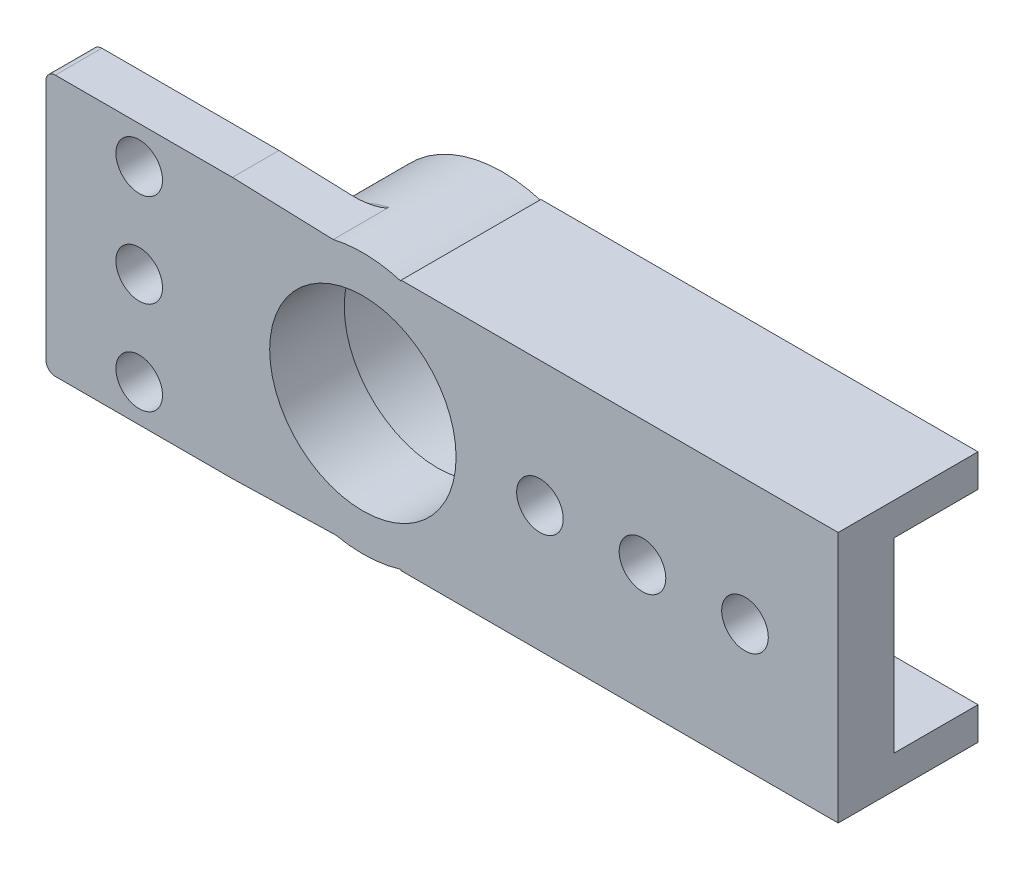
ISO-10303-21;
HEADER;
FILE_DESCRIPTION(('STEP AP214'),'2;1');
FILE_NAME('part.step','',(''),(''),'','','');
FILE_SCHEMA(('AUTOMOTIVE_DESIGN { 1 0 10303 214 1 1 1 1 }'));
ENDSEC;
DATA;
#1=APPLICATION_CONTEXT('core data for automotive mechanical design processes');
#2=APPLICATION_PROTOCOL_DEFINITION('international standard','automotive_design',2000,#1);
#3=PRODUCT_CONTEXT('',#1,'mechanical');
#4=PRODUCT('Part','Part','',(#3));
#5=PRODUCT_RELATED_PRODUCT_CATEGORY('part','',(#4));
#6=PRODUCT_DEFINITION_FORMATION('','',#4);
#7=PRODUCT_DEFINITION_CONTEXT('part definition',#1,'design');
#8=PRODUCT_DEFINITION('design','',#6,#7);
#9=PRODUCT_DEFINITION_SHAPE('','',#8);
#10=(LENGTH_UNIT() NAMED_UNIT(*) SI_UNIT(.MILLI.,.METRE.));
#11=(NAMED_UNIT(*) PLANE_ANGLE_UNIT() SI_UNIT($,.RADIAN.));
#12=(NAMED_UNIT(*) SI_UNIT($,.STERADIAN.) SOLID_ANGLE_UNIT());
#13=UNCERTAINTY_MEASURE_WITH_UNIT(LENGTH_MEASURE(1.E-05),#10,'distance_accuracy_value','');
#14=(GEOMETRIC_REPRESENTATION_CONTEXT(3) GLOBAL_UNCERTAINTY_ASSIGNED_CONTEXT((#13)) GLOBAL_UNIT_ASSIGNED_CONTEXT((#10,
#11,#12)) REPRESENTATION_CONTEXT('',''));
#15=CARTESIAN_POINT('',(0.,0.,0.));
#16=DIRECTION('',(0.,0.,1.));
#17=DIRECTION('',(1.,0.,0.));
#18=AXIS2_PLACEMENT_3D('',#15,#16,#17);
#19=CARTESIAN_POINT('',(-31.,0.,-9.));
#20=DIRECTION('',(0.,0.,1.));
#21=DIRECTION('',(1.,0.,0.));
#22=AXIS2_PLACEMENT_3D('',#19,#20,#21);
#23=CYLINDRICAL_SURFACE('',#22,14.);
#24=DIRECTION('',(0.,0.,1.));
#25=VECTOR('',#24,1.);
#26=CARTESIAN_POINT('',(-33.911999364578,-13.6938036973186,1.));
#27=LINE('',#26,#25);
#28=CARTESIAN_POINT('',(-33.911999364578,-13.6938036973186,0.));
#29=VERTEX_POINT('',#28);
#30=CARTESIAN_POINT('',(-33.911999364578,-13.6938036973186,6.));
#31=VERTEX_POINT('',#30);
#32=EDGE_CURVE('E200',#29,#31,#27,.T.);
#33=ORIENTED_EDGE('',*,*,#32,.F.);
#34=CARTESIAN_POINT('',(-31.,0.,0.));
#35=DIRECTION('',(0.,0.,1.));
#36=DIRECTION('',(1.,0.,0.));
#37=AXIS2_PLACEMENT_3D('',#34,#35,#36);
#38=CIRCLE('',#37,14.);
#39=CARTESIAN_POINT('',(-34.1873805210088,13.632336755461,0.));
#40=VERTEX_POINT('',#39);
#41=EDGE_CURVE('E426',#29,#40,#38,.F.);
#42=ORIENTED_EDGE('',*,*,#41,.T.);
#43=DIRECTION('',(0.,0.,1.));
#44=VECTOR('',#43,1.);
#45=CARTESIAN_POINT('',(-34.1873805210088,13.632336755461,1.));
#46=LINE('',#45,#44);
#47=CARTESIAN_POINT('',(-34.1873805210088,13.632336755461,6.));
#48=VERTEX_POINT('',#47);
#49=EDGE_CURVE('E245',#40,#48,#46,.T.);
#50=ORIENTED_EDGE('',*,*,#49,.T.);
#51=CARTESIAN_POINT('',(-31.,0.,6.));
#52=DIRECTION('',(0.,0.,1.));
#53=DIRECTION('',(1.,0.,0.));
#54=AXIS2_PLACEMENT_3D('',#51,#52,#53);
#55=CIRCLE('',#54,14.);
#56=CARTESIAN_POINT('',(-26.8939671408107,13.3843376436512,6.));
#57=VERTEX_POINT('',#56);
#58=EDGE_CURVE('E318',#57,#48,#55,.T.);
#59=ORIENTED_EDGE('',*,*,#58,.F.);
#60=DIRECTION('',(0.,0.,1.));
#61=VECTOR('',#60,1.);
#62=CARTESIAN_POINT('',(-26.8939671408107,13.3843376436512,-9.));
#63=LINE('',#62,#61);
#64=CARTESIAN_POINT('',(-26.8939671408107,13.3843376436512,-9.));
#65=VERTEX_POINT('',#64);
#66=EDGE_CURVE('E354',#65,#57,#63,.T.);
#67=ORIENTED_EDGE('',*,*,#66,.F.);
#68=CARTESIAN_POINT('',(-31.,0.,-9.));
#69=DIRECTION('',(0.,0.,1.));
#70=DIRECTION('',(1.,0.,0.));
#71=AXIS2_PLACEMENT_3D('',#68,#69,#70);
#72=CIRCLE('',#71,14.);
#73=CARTESIAN_POINT('',(-26.8939671408107,-13.3843376436512,-9.));
#74=VERTEX_POINT('',#73);
#75=EDGE_CURVE('E286',#65,#74,#72,.T.);
#76=ORIENTED_EDGE('',*,*,#75,.T.);
#77=DIRECTION('',(0.,0.,1.));
#78=VECTOR('',#77,1.);
#79=CARTESIAN_POINT('',(-26.8939671408107,-13.3843376436512,-9.));
#80=LINE('',#79,#78);
#81=CARTESIAN_POINT('',(-26.8939671408107,-13.3843376436512,6.));
#82=VERTEX_POINT('',#81);
#83=EDGE_CURVE('E350',#74,#82,#80,.T.);
#84=ORIENTED_EDGE('',*,*,#83,.T.);
#85=EDGE_CURVE('E317',#31,#82,#55,.T.);
#86=ORIENTED_EDGE('',*,*,#85,.F.);
#87=EDGE_LOOP('',(#33,#42,#50,#59,#67,#76,#84,#86));
#88=FACE_BOUND('',#87,.T.);
#89=ADVANCED_FACE('F45',(#88),#23,.T.);
#90=CARTESIAN_POINT('',(-31.,0.,-9.));
#91=DIRECTION('',(0.,0.,1.));
#92=DIRECTION('',(1.,0.,0.));
#93=AXIS2_PLACEMENT_3D('',#90,#91,#92);
#94=CYLINDRICAL_SURFACE('',#93,11.);
#95=CARTESIAN_POINT('',(-31.,0.,-9.));
#96=DIRECTION('',(0.,0.,1.));
#97=DIRECTION('',(1.,0.,0.));
#98=AXIS2_PLACEMENT_3D('',#95,#96,#97);
#99=CIRCLE('',#98,11.);
#100=CARTESIAN_POINT('',(-20.,0.,-9.));
#101=VERTEX_POINT('',#100);
#102=EDGE_CURVE('E259',#101,#101,#99,.T.);
#103=ORIENTED_EDGE('',*,*,#102,.F.);
#104=EDGE_LOOP('',(#103));
#105=FACE_BOUND('',#104,.T.);
#106=CARTESIAN_POINT('',(-31.,0.,-2.));
#107=DIRECTION('',(0.,0.,1.));
#108=DIRECTION('',(1.,0.,0.));
#109=AXIS2_PLACEMENT_3D('',#106,#107,#108);
#110=CIRCLE('',#109,11.);
#111=CARTESIAN_POINT('',(-20.,0.,-2.));
#112=VERTEX_POINT('',#111);
#113=EDGE_CURVE('E420',#112,#112,#110,.F.);
#114=ORIENTED_EDGE('',*,*,#113,.F.);
#115=EDGE_LOOP('',(#114));
#116=FACE_BOUND('',#115,.T.);
#117=ADVANCED_FACE('F496',(#105,#116),#94,.F.);
#118=CARTESIAN_POINT('',(20.,-10.,6.));
#119=DIRECTION('',(-1.,0.,0.));
#120=DIRECTION('',(0.,0.,1.));
#121=AXIS2_PLACEMENT_3D('',#118,#119,#120);
#122=PLANE('',#121);
#123=DIRECTION('',(0.,1.,0.));
#124=VECTOR('',#123,1.);
#125=CARTESIAN_POINT('',(20.,-10.,0.));
#126=LINE('',#125,#124);
#127=CARTESIAN_POINT('',(20.,-10.,0.));
#128=VERTEX_POINT('',#127);
#129=CARTESIAN_POINT('',(20.,10.,0.));
#130=VERTEX_POINT('',#129);
#131=EDGE_CURVE('E412',#128,#130,#126,.T.);
#132=ORIENTED_EDGE('',*,*,#131,.T.);
#133=DIRECTION('',(0.,0.,1.));
#134=VECTOR('',#133,1.);
#135=CARTESIAN_POINT('',(20.,10.,-9.));
#136=LINE('',#135,#134);
#137=CARTESIAN_POINT('',(20.,10.,-9.));
#138=VERTEX_POINT('',#137);
#139=EDGE_CURVE('E364',#138,#130,#136,.T.);
#140=ORIENTED_EDGE('',*,*,#139,.F.);
#141=DIRECTION('',(0.,-1.,0.));
#142=VECTOR('',#141,1.);
#143=CARTESIAN_POINT('',(20.,0.,-9.));
#144=LINE('',#143,#142);
#145=CARTESIAN_POINT('',(20.,13.5,-9.));
#146=VERTEX_POINT('',#145);
#147=EDGE_CURVE('E275',#146,#138,#144,.T.);
#148=ORIENTED_EDGE('',*,*,#147,.F.);
#149=DIRECTION('',(0.,0.,1.));
#150=VECTOR('',#149,1.);
#151=CARTESIAN_POINT('',(20.,13.5,-9.));
#152=LINE('',#151,#150);
#153=CARTESIAN_POINT('',(20.,13.5,6.));
#154=VERTEX_POINT('',#153);
#155=EDGE_CURVE('E360',#146,#154,#152,.T.);
#156=ORIENTED_EDGE('',*,*,#155,.T.);
#157=DIRECTION('',(0.,1.,0.));
#158=VECTOR('',#157,1.);
#159=CARTESIAN_POINT('',(20.,-10.,6.));
#160=LINE('',#159,#158);
#161=CARTESIAN_POINT('',(20.,-13.5,6.));
#162=VERTEX_POINT('',#161);
#163=EDGE_CURVE('E399',#162,#154,#160,.T.);
#164=ORIENTED_EDGE('',*,*,#163,.F.);
#165=DIRECTION('',(0.,0.,1.));
#166=VECTOR('',#165,1.);
#167=CARTESIAN_POINT('',(20.,-13.5,-9.));
#168=LINE('',#167,#166);
#169=CARTESIAN_POINT('',(20.,-13.5,-9.));
#170=VERTEX_POINT('',#169);
#171=EDGE_CURVE('E342',#170,#162,#168,.T.);
#172=ORIENTED_EDGE('',*,*,#171,.F.);
#173=DIRECTION('',(0.,-1.,0.));
#174=VECTOR('',#173,1.);
#175=CARTESIAN_POINT('',(20.,0.,-9.));
#176=LINE('',#175,#174);
#177=CARTESIAN_POINT('',(20.,-10.,-9.));
#178=VERTEX_POINT('',#177);
#179=EDGE_CURVE('E297',#178,#170,#176,.T.);
#180=ORIENTED_EDGE('',*,*,#179,.F.);
#181=DIRECTION('',(0.,0.,1.));
#182=VECTOR('',#181,1.);
#183=CARTESIAN_POINT('',(20.,-10.,-9.));
#184=LINE('',#183,#182);
#185=EDGE_CURVE('E338',#178,#128,#184,.T.);
#186=ORIENTED_EDGE('',*,*,#185,.T.);
#187=EDGE_LOOP('',(#132,#140,#148,#156,#164,#172,#180,#186));
#188=FACE_BOUND('',#187,.T.);
#189=ADVANCED_FACE('F516',(#188),#122,.F.);
#190=CARTESIAN_POINT('',(0.,0.,6.));
#191=DIRECTION('',(0.,0.,1.));
#192=DIRECTION('',(1.,0.,0.));
#193=AXIS2_PLACEMENT_3D('',#190,#191,#192);
#194=PLANE('',#193);
#195=CARTESIAN_POINT('',(-54.9999999999999,-10.,6.));
#196=DIRECTION('',(0.,0.,1.));
#197=DIRECTION('',(1.,0.,0.));
#198=AXIS2_PLACEMENT_3D('',#195,#196,#197);
#199=CIRCLE('',#198,2.49999999999999);
#200=CARTESIAN_POINT('',(-52.4999999999999,-10.,6.));
#201=VERTEX_POINT('',#200);
#202=EDGE_CURVE('E651',#201,#201,#199,.T.);
#203=ORIENTED_EDGE('',*,*,#202,.F.);
#204=EDGE_LOOP('',(#203));
#205=FACE_BOUND('',#204,.T.);
#206=CARTESIAN_POINT('',(-55.,10.,6.));
#207=DIRECTION('',(0.,0.,1.));
#208=DIRECTION('',(1.,0.,0.));
#209=AXIS2_PLACEMENT_3D('',#206,#207,#208);
#210=CIRCLE('',#209,2.49999999999999);
#211=CARTESIAN_POINT('',(-52.5,10.,6.));
#212=VERTEX_POINT('',#211);
#213=EDGE_CURVE('E642',#212,#212,#210,.T.);
#214=ORIENTED_EDGE('',*,*,#213,.F.);
#215=EDGE_LOOP('',(#214));
#216=FACE_BOUND('',#215,.T.);
#217=CARTESIAN_POINT('',(-55.,0.,6.));
#218=DIRECTION('',(0.,0.,1.));
#219=DIRECTION('',(1.,0.,0.));
#220=AXIS2_PLACEMENT_3D('',#217,#218,#219);
#221=CIRCLE('',#220,2.49999999999999);
#222=CARTESIAN_POINT('',(-52.5,0.,6.));
#223=VERTEX_POINT('',#222);
#224=EDGE_CURVE('E645',#223,#223,#221,.T.);
#225=ORIENTED_EDGE('',*,*,#224,.F.);
#226=EDGE_LOOP('',(#225));
#227=FACE_BOUND('',#226,.T.);
#228=DIRECTION('',(-1.,0.,0.));
#229=VECTOR('',#228,1.);
#230=CARTESIAN_POINT('',(1.03216046820618E-13,13.9999999999997,6.));
#231=LINE('',#230,#229);
#232=CARTESIAN_POINT('',(-45.,14.,6.));
#233=VERTEX_POINT('',#232);
#234=CARTESIAN_POINT('',(-64.,14.0000000000001,6.));
#235=VERTEX_POINT('',#234);
#236=EDGE_CURVE('E237',#233,#235,#231,.T.);
#237=ORIENTED_EDGE('',*,*,#236,.T.);
#238=CARTESIAN_POINT('',(-64.,13.0000000000001,6.));
#239=DIRECTION('',(0.,0.,1.));
#240=DIRECTION('',(1.,0.,0.));
#241=AXIS2_PLACEMENT_3D('',#238,#239,#240);
#242=CIRCLE('',#241,1.);
#243=CARTESIAN_POINT('',(-65.,13.0000000000001,6.));
#244=VERTEX_POINT('',#243);
#245=EDGE_CURVE('E583',#235,#244,#242,.T.);
#246=ORIENTED_EDGE('',*,*,#245,.T.);
#247=DIRECTION('',(0.,1.,0.));
#248=VECTOR('',#247,1.);
#249=CARTESIAN_POINT('',(-65.,0.,6.));
#250=LINE('',#249,#248);
#251=CARTESIAN_POINT('',(-65.,-12.9999999999999,6.));
#252=VERTEX_POINT('',#251);
#253=EDGE_CURVE('E225',#252,#244,#250,.T.);
#254=ORIENTED_EDGE('',*,*,#253,.F.);
#255=CARTESIAN_POINT('',(-64.,-12.9999999999999,6.));
#256=DIRECTION('',(0.,0.,1.));
#257=DIRECTION('',(1.,0.,0.));
#258=AXIS2_PLACEMENT_3D('',#255,#256,#257);
#259=CIRCLE('',#258,1.);
#260=CARTESIAN_POINT('',(-64.,-13.9999999999999,6.));
#261=VERTEX_POINT('',#260);
#262=EDGE_CURVE('E580',#252,#261,#259,.T.);
#263=ORIENTED_EDGE('',*,*,#262,.T.);
#264=DIRECTION('',(-1.,0.,0.));
#265=VECTOR('',#264,1.);
#266=CARTESIAN_POINT('',(-1.04430353253806E-13,-14.0000000000003,6.));
#267=LINE('',#266,#265);
#268=CARTESIAN_POINT('',(-45.,-14.,6.));
#269=VERTEX_POINT('',#268);
#270=EDGE_CURVE('E228',#269,#261,#267,.T.);
#271=ORIENTED_EDGE('',*,*,#270,.F.);
#272=DIRECTION('',(0.999618920928315,0.0276045815420301,0.));
#273=VECTOR('',#272,1.);
#274=CARTESIAN_POINT('',(0.352026286697129,-12.747599028473,6.));
#275=LINE('',#274,#273);
#276=EDGE_CURVE('E197',#269,#31,#275,.T.);
#277=ORIENTED_EDGE('',*,*,#276,.T.);
#278=ORIENTED_EDGE('',*,*,#85,.T.);
#279=DIRECTION('',(0.,1.,0.));
#280=VECTOR('',#279,1.);
#281=CARTESIAN_POINT('',(-26.8939671408107,0.,6.));
#282=LINE('',#281,#280);
#283=CARTESIAN_POINT('',(-26.8939671408107,-13.5,6.));
#284=VERTEX_POINT('',#283);
#285=EDGE_CURVE('E322',#284,#82,#282,.T.);
#286=ORIENTED_EDGE('',*,*,#285,.F.);
#287=DIRECTION('',(-1.,0.,0.));
#288=VECTOR('',#287,1.);
#289=CARTESIAN_POINT('',(0.,-13.5,6.));
#290=LINE('',#289,#288);
#291=EDGE_CURVE('E264',#162,#284,#290,.T.);
#292=ORIENTED_EDGE('',*,*,#291,.F.);
#293=ORIENTED_EDGE('',*,*,#163,.T.);
#294=DIRECTION('',(-1.,0.,0.));
#295=VECTOR('',#294,1.);
#296=CARTESIAN_POINT('',(0.,13.5,6.));
#297=LINE('',#296,#295);
#298=CARTESIAN_POINT('',(-26.8939671408107,13.5,6.));
#299=VERTEX_POINT('',#298);
#300=EDGE_CURVE('E255',#154,#299,#297,.T.);
#301=ORIENTED_EDGE('',*,*,#300,.T.);
#302=DIRECTION('',(0.,1.,0.));
#303=VECTOR('',#302,1.);
#304=CARTESIAN_POINT('',(-26.8939671408107,0.,6.));
#305=LINE('',#304,#303);
#306=EDGE_CURVE('E313',#57,#299,#305,.T.);
#307=ORIENTED_EDGE('',*,*,#306,.F.);
#308=ORIENTED_EDGE('',*,*,#58,.T.);
#309=DIRECTION('',(0.999422393339672,-0.0339835208770759,0.));
#310=VECTOR('',#309,1.);
#311=CARTESIAN_POINT('',(0.423524898662943,12.4554565547147,6.));
#312=LINE('',#311,#310);
#313=EDGE_CURVE('E234',#233,#48,#312,.T.);
#314=ORIENTED_EDGE('',*,*,#313,.F.);
#315=EDGE_LOOP('',(#237,#246,#254,#263,#271,#277,#278,#286,#292,#293,#301,#307,#308,#314));
#316=FACE_BOUND('',#315,.T.);
#317=CARTESIAN_POINT('',(10.,0.,6.));
#318=DIRECTION('',(0.,0.,1.));
#319=DIRECTION('',(1.,0.,0.));
#320=AXIS2_PLACEMENT_3D('',#317,#318,#319);
#321=CIRCLE('',#320,2.5);
#322=CARTESIAN_POINT('',(12.5,0.,6.));
#323=VERTEX_POINT('',#322);
#324=EDGE_CURVE('E380',#323,#323,#321,.T.);
#325=ORIENTED_EDGE('',*,*,#324,.F.);
#326=EDGE_LOOP('',(#325));
#327=FACE_BOUND('',#326,.T.);
#328=CARTESIAN_POINT('',(-0.999999999999999,0.,6.));
#329=DIRECTION('',(0.,0.,1.));
#330=DIRECTION('',(1.,0.,0.));
#331=AXIS2_PLACEMENT_3D('',#328,#329,#330);
#332=CIRCLE('',#331,2.5);
#333=CARTESIAN_POINT('',(1.5,0.,6.));
#334=VERTEX_POINT('',#333);
#335=EDGE_CURVE('E384',#334,#334,#332,.T.);
#336=ORIENTED_EDGE('',*,*,#335,.F.);
#337=EDGE_LOOP('',(#336));
#338=FACE_BOUND('',#337,.T.);
#339=CARTESIAN_POINT('',(-12.,-1.53625178909098E-13,6.));
#340=DIRECTION('',(0.,0.,1.));
#341=DIRECTION('',(1.,0.,0.));
#342=AXIS2_PLACEMENT_3D('',#339,#340,#341);
#343=CIRCLE('',#342,2.5);
#344=CARTESIAN_POINT('',(-9.5,-1.53625178909098E-13,6.));
#345=VERTEX_POINT('',#344);
#346=EDGE_CURVE('E392',#345,#345,#343,.T.);
#347=ORIENTED_EDGE('',*,*,#346,.F.);
#348=EDGE_LOOP('',(#347));
#349=FACE_BOUND('',#348,.T.);
#350=CARTESIAN_POINT('',(-31.,0.,6.));
#351=DIRECTION('',(0.,0.,1.));
#352=DIRECTION('',(1.,0.,0.));
#353=AXIS2_PLACEMENT_3D('',#350,#351,#352);
#354=CIRCLE('',#353,10.);
#355=CARTESIAN_POINT('',(-21.,0.,6.));
#356=VERTEX_POINT('',#355);
#357=EDGE_CURVE('E244',#356,#356,#354,.T.);
#358=ORIENTED_EDGE('',*,*,#357,.F.);
#359=EDGE_LOOP('',(#358));
#360=FACE_BOUND('',#359,.T.);
#361=ADVANCED_FACE('F530',(#205,#216,#227,#316,#327,#338,#349,#360),#194,.T.);
#362=CARTESIAN_POINT('',(0.,0.,0.));
#363=DIRECTION('',(0.,0.,1.));
#364=DIRECTION('',(1.,0.,0.));
#365=AXIS2_PLACEMENT_3D('',#362,#363,#364);
#366=PLANE('',#365);
#367=CARTESIAN_POINT('',(10.,0.,0.));
#368=DIRECTION('',(0.,0.,1.));
#369=DIRECTION('',(1.,0.,0.));
#370=AXIS2_PLACEMENT_3D('',#367,#368,#369);
#371=CIRCLE('',#370,2.5);
#372=CARTESIAN_POINT('',(12.5,0.,0.));
#373=VERTEX_POINT('',#372);
#374=EDGE_CURVE('E375',#373,#373,#371,.T.);
#375=ORIENTED_EDGE('',*,*,#374,.T.);
#376=EDGE_LOOP('',(#375));
#377=FACE_BOUND('',#376,.T.);
#378=CARTESIAN_POINT('',(-0.999999999999999,0.,0.));
#379=DIRECTION('',(0.,0.,1.));
#380=DIRECTION('',(1.,0.,0.));
#381=AXIS2_PLACEMENT_3D('',#378,#379,#380);
#382=CIRCLE('',#381,2.5);
#383=CARTESIAN_POINT('',(1.5,0.,0.));
#384=VERTEX_POINT('',#383);
#385=EDGE_CURVE('E388',#384,#384,#382,.T.);
#386=ORIENTED_EDGE('',*,*,#385,.T.);
#387=EDGE_LOOP('',(#386));
#388=FACE_BOUND('',#387,.T.);
#389=CARTESIAN_POINT('',(-12.,-1.53625178909098E-13,0.));
#390=DIRECTION('',(0.,0.,1.));
#391=DIRECTION('',(1.,0.,0.));
#392=AXIS2_PLACEMENT_3D('',#389,#390,#391);
#393=CIRCLE('',#392,2.5);
#394=CARTESIAN_POINT('',(-9.5,-1.53625178909098E-13,0.));
#395=VERTEX_POINT('',#394);
#396=EDGE_CURVE('E333',#395,#395,#393,.T.);
#397=ORIENTED_EDGE('',*,*,#396,.T.);
#398=EDGE_LOOP('',(#397));
#399=FACE_BOUND('',#398,.T.);
#400=DIRECTION('',(0.,-1.,0.));
#401=VECTOR('',#400,1.);
#402=CARTESIAN_POINT('',(-20.,-10.,0.));
#403=LINE('',#402,#401);
#404=CARTESIAN_POINT('',(-20.,-8.66025403784439,0.));
#405=VERTEX_POINT('',#404);
#406=CARTESIAN_POINT('',(-20.,-10.,0.));
#407=VERTEX_POINT('',#406);
#408=EDGE_CURVE('E379',#405,#407,#403,.T.);
#409=ORIENTED_EDGE('',*,*,#408,.F.);
#410=CARTESIAN_POINT('',(-31.,0.,0.));
#411=DIRECTION('',(0.,0.,1.));
#412=DIRECTION('',(1.,0.,0.));
#413=AXIS2_PLACEMENT_3D('',#410,#411,#412);
#414=CIRCLE('',#413,14.);
#415=CARTESIAN_POINT('',(-20.,8.66025403784439,0.));
#416=VERTEX_POINT('',#415);
#417=EDGE_CURVE('E402',#405,#416,#414,.T.);
#418=ORIENTED_EDGE('',*,*,#417,.T.);
#419=CARTESIAN_POINT('',(-20.,10.,0.));
#420=VERTEX_POINT('',#419);
#421=EDGE_CURVE('E404',#420,#416,#403,.T.);
#422=ORIENTED_EDGE('',*,*,#421,.F.);
#423=DIRECTION('',(-1.,0.,0.));
#424=VECTOR('',#423,1.);
#425=CARTESIAN_POINT('',(20.,10.,0.));
#426=LINE('',#425,#424);
#427=EDGE_CURVE('E403',#130,#420,#426,.T.);
#428=ORIENTED_EDGE('',*,*,#427,.F.);
#429=ORIENTED_EDGE('',*,*,#131,.F.);
#430=DIRECTION('',(1.,0.,0.));
#431=VECTOR('',#430,1.);
#432=CARTESIAN_POINT('',(20.,-10.,0.));
#433=LINE('',#432,#431);
#434=EDGE_CURVE('E408',#407,#128,#433,.T.);
#435=ORIENTED_EDGE('',*,*,#434,.F.);
#436=EDGE_LOOP('',(#409,#418,#422,#428,#429,#435));
#437=FACE_BOUND('',#436,.T.);
#438=ADVANCED_FACE('F528',(#377,#388,#399,#437),#366,.F.);
#439=CARTESIAN_POINT('',(-12.,-1.53625178909098E-13,0.));
#440=DIRECTION('',(0.,0.,1.));
#441=DIRECTION('',(1.,0.,0.));
#442=AXIS2_PLACEMENT_3D('',#439,#440,#441);
#443=CYLINDRICAL_SURFACE('',#442,2.5);
#444=ORIENTED_EDGE('',*,*,#396,.F.);
#445=EDGE_LOOP('',(#444));
#446=FACE_BOUND('',#445,.T.);
#447=ORIENTED_EDGE('',*,*,#346,.T.);
#448=EDGE_LOOP('',(#447));
#449=FACE_BOUND('',#448,.T.);
#450=ADVANCED_FACE('F524',(#446,#449),#443,.F.);
#451=CARTESIAN_POINT('',(-0.999999999999999,0.,0.));
#452=DIRECTION('',(0.,0.,1.));
#453=DIRECTION('',(1.,0.,0.));
#454=AXIS2_PLACEMENT_3D('',#451,#452,#453);
#455=CYLINDRICAL_SURFACE('',#454,2.5);
#456=ORIENTED_EDGE('',*,*,#385,.F.);
#457=EDGE_LOOP('',(#456));
#458=FACE_BOUND('',#457,.T.);
#459=ORIENTED_EDGE('',*,*,#335,.T.);
#460=EDGE_LOOP('',(#459));
#461=FACE_BOUND('',#460,.T.);
#462=ADVANCED_FACE('F520',(#458,#461),#455,.F.);
#463=CARTESIAN_POINT('',(10.,0.,0.));
#464=DIRECTION('',(0.,0.,1.));
#465=DIRECTION('',(1.,0.,0.));
#466=AXIS2_PLACEMENT_3D('',#463,#464,#465);
#467=CYLINDRICAL_SURFACE('',#466,2.5);
#468=ORIENTED_EDGE('',*,*,#374,.F.);
#469=EDGE_LOOP('',(#468));
#470=FACE_BOUND('',#469,.T.);
#471=ORIENTED_EDGE('',*,*,#324,.T.);
#472=EDGE_LOOP('',(#471));
#473=FACE_BOUND('',#472,.T.);
#474=ADVANCED_FACE('F512',(#470,#473),#467,.F.);
#475=CARTESIAN_POINT('',(-31.,0.,-9.));
#476=DIRECTION('',(0.,0.,1.));
#477=DIRECTION('',(1.,0.,0.));
#478=AXIS2_PLACEMENT_3D('',#475,#476,#477);
#479=CYLINDRICAL_SURFACE('',#478,14.);
#480=ORIENTED_EDGE('',*,*,#417,.F.);
#481=DIRECTION('',(0.,0.,1.));
#482=VECTOR('',#481,1.);
#483=CARTESIAN_POINT('',(-20.,-8.66025403784439,-9.));
#484=LINE('',#483,#482);
#485=CARTESIAN_POINT('',(-20.,-8.66025403784439,-9.));
#486=VERTEX_POINT('',#485);
#487=EDGE_CURVE('E329',#486,#405,#484,.T.);
#488=ORIENTED_EDGE('',*,*,#487,.F.);
#489=CARTESIAN_POINT('',(-31.,0.,-9.));
#490=DIRECTION('',(0.,0.,1.));
#491=DIRECTION('',(1.,0.,0.));
#492=AXIS2_PLACEMENT_3D('',#489,#490,#491);
#493=CIRCLE('',#492,14.);
#494=CARTESIAN_POINT('',(-20.,8.66025403784439,-9.));
#495=VERTEX_POINT('',#494);
#496=EDGE_CURVE('E263',#486,#495,#493,.T.);
#497=ORIENTED_EDGE('',*,*,#496,.T.);
#498=DIRECTION('',(0.,0.,1.));
#499=VECTOR('',#498,1.);
#500=CARTESIAN_POINT('',(-20.,8.66025403784439,-9.));
#501=LINE('',#500,#499);
#502=EDGE_CURVE('E309',#495,#416,#501,.T.);
#503=ORIENTED_EDGE('',*,*,#502,.T.);
#504=EDGE_LOOP('',(#480,#488,#497,#503));
#505=FACE_BOUND('',#504,.T.);
#506=ADVANCED_FACE('F478',(#505),#479,.T.);
#507=CARTESIAN_POINT('',(-20.,0.,-9.));
#508=DIRECTION('',(-1.,0.,0.));
#509=DIRECTION('',(0.,0.,1.));
#510=AXIS2_PLACEMENT_3D('',#507,#508,#509);
#511=PLANE('',#510);
#512=ORIENTED_EDGE('',*,*,#487,.T.);
#513=ORIENTED_EDGE('',*,*,#408,.T.);
#514=DIRECTION('',(0.,0.,1.));
#515=VECTOR('',#514,1.);
#516=CARTESIAN_POINT('',(-20.,-10.,-9.));
#517=LINE('',#516,#515);
#518=CARTESIAN_POINT('',(-20.,-10.,-9.));
#519=VERTEX_POINT('',#518);
#520=EDGE_CURVE('E334',#519,#407,#517,.T.);
#521=ORIENTED_EDGE('',*,*,#520,.F.);
#522=DIRECTION('',(0.,-1.,0.));
#523=VECTOR('',#522,1.);
#524=CARTESIAN_POINT('',(-20.,0.,-9.));
#525=LINE('',#524,#523);
#526=EDGE_CURVE('E305',#486,#519,#525,.T.);
#527=ORIENTED_EDGE('',*,*,#526,.F.);
#528=EDGE_LOOP('',(#512,#513,#521,#527));
#529=FACE_BOUND('',#528,.T.);
#530=ADVANCED_FACE('F474',(#529),#511,.F.);
#531=CARTESIAN_POINT('',(0.,-10.,-9.));
#532=DIRECTION('',(0.,-1.,0.));
#533=DIRECTION('',(1.,0.,0.));
#534=AXIS2_PLACEMENT_3D('',#531,#532,#533);
#535=PLANE('',#534);
#536=ORIENTED_EDGE('',*,*,#520,.T.);
#537=ORIENTED_EDGE('',*,*,#434,.T.);
#538=ORIENTED_EDGE('',*,*,#185,.F.);
#539=DIRECTION('',(1.,0.,0.));
#540=VECTOR('',#539,1.);
#541=CARTESIAN_POINT('',(0.,-10.,-9.));
#542=LINE('',#541,#540);
#543=EDGE_CURVE('E301',#519,#178,#542,.T.);
#544=ORIENTED_EDGE('',*,*,#543,.F.);
#545=EDGE_LOOP('',(#536,#537,#538,#544));
#546=FACE_BOUND('',#545,.T.);
#547=ADVANCED_FACE('F477',(#546),#535,.F.);
#548=CARTESIAN_POINT('',(0.,10.,-9.));
#549=DIRECTION('',(0.,1.,0.));
#550=DIRECTION('',(-1.,0.,0.));
#551=AXIS2_PLACEMENT_3D('',#548,#549,#550);
#552=PLANE('',#551);
#553=ORIENTED_EDGE('',*,*,#139,.T.);
#554=ORIENTED_EDGE('',*,*,#427,.T.);
#555=DIRECTION('',(0.,0.,1.));
#556=VECTOR('',#555,1.);
#557=CARTESIAN_POINT('',(-20.,10.,-9.));
#558=LINE('',#557,#556);
#559=CARTESIAN_POINT('',(-20.,10.,-9.));
#560=VERTEX_POINT('',#559);
#561=EDGE_CURVE('E368',#560,#420,#558,.T.);
#562=ORIENTED_EDGE('',*,*,#561,.F.);
#563=DIRECTION('',(-1.,0.,0.));
#564=VECTOR('',#563,1.);
#565=CARTESIAN_POINT('',(0.,10.,-9.));
#566=LINE('',#565,#564);
#567=EDGE_CURVE('E271',#138,#560,#566,.T.);
#568=ORIENTED_EDGE('',*,*,#567,.F.);
#569=EDGE_LOOP('',(#553,#554,#562,#568));
#570=FACE_BOUND('',#569,.T.);
#571=ADVANCED_FACE('F482',(#570),#552,.F.);
#572=CARTESIAN_POINT('',(-20.,0.,-9.));
#573=DIRECTION('',(-1.,0.,0.));
#574=DIRECTION('',(0.,0.,1.));
#575=AXIS2_PLACEMENT_3D('',#572,#573,#574);
#576=PLANE('',#575);
#577=ORIENTED_EDGE('',*,*,#561,.T.);
#578=ORIENTED_EDGE('',*,*,#421,.T.);
#579=ORIENTED_EDGE('',*,*,#502,.F.);
#580=DIRECTION('',(0.,-1.,0.));
#581=VECTOR('',#580,1.);
#582=CARTESIAN_POINT('',(-20.,0.,-9.));
#583=LINE('',#582,#581);
#584=EDGE_CURVE('E268',#560,#495,#583,.T.);
#585=ORIENTED_EDGE('',*,*,#584,.F.);
#586=EDGE_LOOP('',(#577,#578,#579,#585));
#587=FACE_BOUND('',#586,.T.);
#588=ADVANCED_FACE('F488',(#587),#576,.F.);
#589=CARTESIAN_POINT('',(0.,-13.5,-9.));
#590=DIRECTION('',(0.,1.,0.));
#591=DIRECTION('',(0.,0.,1.));
#592=AXIS2_PLACEMENT_3D('',#589,#590,#591);
#593=PLANE('',#592);
#594=ORIENTED_EDGE('',*,*,#291,.T.);
#595=DIRECTION('',(0.,0.,1.));
#596=VECTOR('',#595,1.);
#597=CARTESIAN_POINT('',(-26.8939671408107,-13.5,-9.));
#598=LINE('',#597,#596);
#599=CARTESIAN_POINT('',(-26.8939671408107,-13.5,-9.));
#600=VERTEX_POINT('',#599);
#601=EDGE_CURVE('E346',#600,#284,#598,.T.);
#602=ORIENTED_EDGE('',*,*,#601,.F.);
#603=DIRECTION('',(-1.,0.,0.));
#604=VECTOR('',#603,1.);
#605=CARTESIAN_POINT('',(0.,-13.5,-9.));
#606=LINE('',#605,#604);
#607=EDGE_CURVE('E293',#170,#600,#606,.T.);
#608=ORIENTED_EDGE('',*,*,#607,.F.);
#609=ORIENTED_EDGE('',*,*,#171,.T.);
#610=EDGE_LOOP('',(#594,#602,#608,#609));
#611=FACE_BOUND('',#610,.T.);
#612=ADVANCED_FACE('F484',(#611),#593,.F.);
#613=CARTESIAN_POINT('',(-26.8939671408107,0.,-9.));
#614=DIRECTION('',(1.,0.,0.));
#615=DIRECTION('',(0.,0.,-1.));
#616=AXIS2_PLACEMENT_3D('',#613,#614,#615);
#617=PLANE('',#616);
#618=ORIENTED_EDGE('',*,*,#285,.T.);
#619=ORIENTED_EDGE('',*,*,#83,.F.);
#620=DIRECTION('',(0.,1.,0.));
#621=VECTOR('',#620,1.);
#622=CARTESIAN_POINT('',(-26.8939671408107,0.,-9.));
#623=LINE('',#622,#621);
#624=EDGE_CURVE('E290',#600,#74,#623,.T.);
#625=ORIENTED_EDGE('',*,*,#624,.F.);
#626=ORIENTED_EDGE('',*,*,#601,.T.);
#627=EDGE_LOOP('',(#618,#619,#625,#626));
#628=FACE_BOUND('',#627,.T.);
#629=ADVANCED_FACE('F487',(#628),#617,.F.);
#630=CARTESIAN_POINT('',(-26.8939671408107,0.,-9.));
#631=DIRECTION('',(1.,0.,0.));
#632=DIRECTION('',(0.,0.,-1.));
#633=AXIS2_PLACEMENT_3D('',#630,#631,#632);
#634=PLANE('',#633);
#635=ORIENTED_EDGE('',*,*,#306,.T.);
#636=DIRECTION('',(0.,0.,1.));
#637=VECTOR('',#636,1.);
#638=CARTESIAN_POINT('',(-26.8939671408107,13.5,-9.));
#639=LINE('',#638,#637);
#640=CARTESIAN_POINT('',(-26.8939671408107,13.5,-9.));
#641=VERTEX_POINT('',#640);
#642=EDGE_CURVE('E357',#641,#299,#639,.T.);
#643=ORIENTED_EDGE('',*,*,#642,.F.);
#644=DIRECTION('',(0.,1.,0.));
#645=VECTOR('',#644,1.);
#646=CARTESIAN_POINT('',(-26.8939671408107,0.,-9.));
#647=LINE('',#646,#645);
#648=EDGE_CURVE('E283',#65,#641,#647,.T.);
#649=ORIENTED_EDGE('',*,*,#648,.F.);
#650=ORIENTED_EDGE('',*,*,#66,.T.);
#651=EDGE_LOOP('',(#635,#643,#649,#650));
#652=FACE_BOUND('',#651,.T.);
#653=ADVANCED_FACE('F492',(#652),#634,.F.);
#654=CARTESIAN_POINT('',(0.,13.5,-9.));
#655=DIRECTION('',(0.,1.,0.));
#656=DIRECTION('',(-1.,0.,0.));
#657=AXIS2_PLACEMENT_3D('',#654,#655,#656);
#658=PLANE('',#657);
#659=ORIENTED_EDGE('',*,*,#300,.F.);
#660=ORIENTED_EDGE('',*,*,#155,.F.);
#661=DIRECTION('',(-1.,0.,0.));
#662=VECTOR('',#661,1.);
#663=CARTESIAN_POINT('',(0.,13.5,-9.));
#664=LINE('',#663,#662);
#665=EDGE_CURVE('E279',#146,#641,#664,.T.);
#666=ORIENTED_EDGE('',*,*,#665,.T.);
#667=ORIENTED_EDGE('',*,*,#642,.T.);
#668=EDGE_LOOP('',(#659,#660,#666,#667));
#669=FACE_BOUND('',#668,.T.);
#670=ADVANCED_FACE('F472',(#669),#658,.T.);
#671=CARTESIAN_POINT('',(0.,0.,-9.));
#672=DIRECTION('',(0.,0.,1.));
#673=DIRECTION('',(1.,0.,0.));
#674=AXIS2_PLACEMENT_3D('',#671,#672,#673);
#675=PLANE('',#674);
#676=ORIENTED_EDGE('',*,*,#102,.T.);
#677=EDGE_LOOP('',(#676));
#678=FACE_BOUND('',#677,.T.);
#679=ORIENTED_EDGE('',*,*,#496,.F.);
#680=ORIENTED_EDGE('',*,*,#526,.T.);
#681=ORIENTED_EDGE('',*,*,#543,.T.);
#682=ORIENTED_EDGE('',*,*,#179,.T.);
#683=ORIENTED_EDGE('',*,*,#607,.T.);
#684=ORIENTED_EDGE('',*,*,#624,.T.);
#685=ORIENTED_EDGE('',*,*,#75,.F.);
#686=ORIENTED_EDGE('',*,*,#648,.T.);
#687=ORIENTED_EDGE('',*,*,#665,.F.);
#688=ORIENTED_EDGE('',*,*,#147,.T.);
#689=ORIENTED_EDGE('',*,*,#567,.T.);
#690=ORIENTED_EDGE('',*,*,#584,.T.);
#691=EDGE_LOOP('',(#679,#680,#681,#682,#683,#684,#685,#686,#687,#688,#689,#690));
#692=FACE_BOUND('',#691,.T.);
#693=ADVANCED_FACE('F468',(#678,#692),#675,.F.);
#694=CARTESIAN_POINT('',(-31.,0.,-2.));
#695=DIRECTION('',(0.,0.,1.));
#696=DIRECTION('',(1.,0.,0.));
#697=AXIS2_PLACEMENT_3D('',#694,#695,#696);
#698=PLANE('',#697);
#699=CARTESIAN_POINT('',(-31.,0.,-2.));
#700=DIRECTION('',(0.,0.,1.));
#701=DIRECTION('',(1.,0.,0.));
#702=AXIS2_PLACEMENT_3D('',#699,#700,#701);
#703=CIRCLE('',#702,10.);
#704=CARTESIAN_POINT('',(-21.,0.,-2.));
#705=VERTEX_POINT('',#704);
#706=EDGE_CURVE('E251',#705,#705,#703,.T.);
#707=ORIENTED_EDGE('',*,*,#706,.T.);
#708=EDGE_LOOP('',(#707));
#709=FACE_BOUND('',#708,.T.);
#710=ORIENTED_EDGE('',*,*,#113,.T.);
#711=EDGE_LOOP('',(#710));
#712=FACE_BOUND('',#711,.T.);
#713=ADVANCED_FACE('F464',(#709,#712),#698,.F.);
#714=CARTESIAN_POINT('',(-31.,0.,-2.));
#715=DIRECTION('',(0.,0.,1.));
#716=DIRECTION('',(1.,0.,0.));
#717=AXIS2_PLACEMENT_3D('',#714,#715,#716);
#718=CYLINDRICAL_SURFACE('',#717,10.);
#719=ORIENTED_EDGE('',*,*,#706,.F.);
#720=EDGE_LOOP('',(#719));
#721=FACE_BOUND('',#720,.T.);
#722=ORIENTED_EDGE('',*,*,#357,.T.);
#723=EDGE_LOOP('',(#722));
#724=FACE_BOUND('',#723,.T.);
#725=ADVANCED_FACE('F461',(#721,#724),#718,.F.);
#726=CARTESIAN_POINT('',(-65.,0.,1.));
#727=DIRECTION('',(1.,0.,0.));
#728=DIRECTION('',(0.,0.,-1.));
#729=AXIS2_PLACEMENT_3D('',#726,#727,#728);
#730=PLANE('',#729);
#731=ORIENTED_EDGE('',*,*,#253,.T.);
#732=DIRECTION('',(0.,0.,1.));
#733=VECTOR('',#732,1.);
#734=CARTESIAN_POINT('',(-65.,13.0000000000001,1.));
#735=LINE('',#734,#733);
#736=CARTESIAN_POINT('',(-65.,13.0000000000001,1.));
#737=VERTEX_POINT('',#736);
#738=EDGE_CURVE('E67',#244,#737,#735,.F.);
#739=ORIENTED_EDGE('',*,*,#738,.T.);
#740=DIRECTION('',(0.,1.,0.));
#741=VECTOR('',#740,1.);
#742=CARTESIAN_POINT('',(-65.,0.,1.));
#743=LINE('',#742,#741);
#744=CARTESIAN_POINT('',(-65.,-12.9999999999999,1.));
#745=VERTEX_POINT('',#744);
#746=EDGE_CURVE('E208',#745,#737,#743,.T.);
#747=ORIENTED_EDGE('',*,*,#746,.F.);
#748=DIRECTION('',(0.,0.,1.));
#749=VECTOR('',#748,1.);
#750=CARTESIAN_POINT('',(-65.,-12.9999999999999,1.));
#751=LINE('',#750,#749);
#752=EDGE_CURVE('E588',#745,#252,#751,.T.);
#753=ORIENTED_EDGE('',*,*,#752,.T.);
#754=EDGE_LOOP('',(#731,#739,#747,#753));
#755=FACE_BOUND('',#754,.T.);
#756=ADVANCED_FACE('F457',(#755),#730,.F.);
#757=CARTESIAN_POINT('',(1.03216046820618E-13,13.9999999999997,1.));
#758=DIRECTION('',(0.,1.,0.));
#759=DIRECTION('',(-1.,0.,0.));
#760=AXIS2_PLACEMENT_3D('',#757,#758,#759);
#761=PLANE('',#760);
#762=DIRECTION('',(-1.,0.,0.));
#763=VECTOR('',#762,1.);
#764=CARTESIAN_POINT('',(1.03216046820618E-13,13.9999999999997,1.));
#765=LINE('',#764,#763);
#766=CARTESIAN_POINT('',(-45.,14.,1.));
#767=VERTEX_POINT('',#766);
#768=CARTESIAN_POINT('',(-64.,14.0000000000001,1.));
#769=VERTEX_POINT('',#768);
#770=EDGE_CURVE('E201',#767,#769,#765,.T.);
#771=ORIENTED_EDGE('',*,*,#770,.T.);
#772=DIRECTION('',(0.,0.,1.));
#773=VECTOR('',#772,1.);
#774=CARTESIAN_POINT('',(-64.,14.0000000000001,6.));
#775=LINE('',#774,#773);
#776=EDGE_CURVE('E575',#769,#235,#775,.T.);
#777=ORIENTED_EDGE('',*,*,#776,.T.);
#778=ORIENTED_EDGE('',*,*,#236,.F.);
#779=DIRECTION('',(0.,0.,1.));
#780=VECTOR('',#779,1.);
#781=CARTESIAN_POINT('',(-45.,14.,1.));
#782=LINE('',#781,#780);
#783=EDGE_CURVE('E241',#767,#233,#782,.T.);
#784=ORIENTED_EDGE('',*,*,#783,.F.);
#785=EDGE_LOOP('',(#771,#777,#778,#784));
#786=FACE_BOUND('',#785,.T.);
#787=ADVANCED_FACE('F460',(#786),#761,.T.);
#788=CARTESIAN_POINT('',(0.423524898662943,12.4554565547147,1.));
#789=DIRECTION('',(-0.0339835208770759,-0.999422393339672,0.));
#790=DIRECTION('',(0.999422393339672,-0.0339835208770759,0.));
#791=AXIS2_PLACEMENT_3D('',#788,#789,#790);
#792=PLANE('',#791);
#793=ORIENTED_EDGE('',*,*,#313,.T.);
#794=ORIENTED_EDGE('',*,*,#49,.F.);
#795=CARTESIAN_POINT('',(-34.1873805210088,13.632336755461,0.));
#796=CARTESIAN_POINT('',(-34.1873086857466,13.632334312835,0.0183395667176775));
#797=CARTESIAN_POINT('',(-34.1893118747166,13.6324024275927,0.0365630013017043));
#798=CARTESIAN_POINT('',(-34.196744897519,13.6326551738662,0.0719868752258515));
#799=CARTESIAN_POINT('',(-34.2021152391686,13.6328377824598,0.0891995144719637));
#800=CARTESIAN_POINT('',(-34.2173753322784,13.6333566738677,0.126848072643649));
#801=CARTESIAN_POINT('',(-34.2280820541797,13.6337207362598,0.146941728552138));
#802=CARTESIAN_POINT('',(-34.252530894605,13.6345520741251,0.18530834595942));
#803=CARTESIAN_POINT('',(-34.2662945515155,13.6350200819715,0.203566981898554));
#804=CARTESIAN_POINT('',(-34.3088803731158,13.6364681345337,0.253789497682567));
#805=CARTESIAN_POINT('',(-34.3402390966296,13.6375344302685,0.283561541772798));
#806=CARTESIAN_POINT('',(-34.4064558561897,13.6397860094265,0.338774202216822));
#807=CARTESIAN_POINT('',(-34.441321648059,13.6409715565723,0.364204867444762));
#808=CARTESIAN_POINT('',(-34.5074547830781,13.6432202922316,0.408164209978597));
#809=CARTESIAN_POINT('',(-34.5384226824398,13.6442732987096,0.427148913638906));
#810=CARTESIAN_POINT('',(-34.601378108994,13.6464139822353,0.463355135291737));
#811=CARTESIAN_POINT('',(-34.6333661243575,13.6475016758823,0.480575791988522));
#812=CARTESIAN_POINT('',(-34.7305327941134,13.6508056498299,0.530153960911473));
#813=CARTESIAN_POINT('',(-34.7968057435007,13.6530591396197,0.560359777680457));
#814=CARTESIAN_POINT('',(-34.9315860429666,13.6576420958865,0.616820141141722));
#815=CARTESIAN_POINT('',(-35.0001070102658,13.659972025392,0.643041206830119));
#816=CARTESIAN_POINT('',(-35.1382790082064,13.6646703101292,0.692052816296685));
#817=CARTESIAN_POINT('',(-35.2079288365804,13.66703862448,0.714846774192712));
#818=CARTESIAN_POINT('',(-35.3508252287159,13.6718975535552,0.758344928341559));
#819=CARTESIAN_POINT('',(-35.4241065971095,13.6743893517471,0.778933951273743));
#820=CARTESIAN_POINT('',(-35.571411494167,13.6793981839264,0.817264661273604));
#821=CARTESIAN_POINT('',(-35.6454351227515,13.6819152213113,0.835005959370459));
#822=CARTESIAN_POINT('',(-35.8685299683636,13.6895011513385,0.884246007163939));
#823=CARTESIAN_POINT('',(-36.0185136378726,13.6946010702496,0.911727735066648));
#824=CARTESIAN_POINT('',(-36.2415070084388,13.7021835498044,0.944564329081125));
#825=CARTESIAN_POINT('',(-36.3139496152629,13.7046468274513,0.953990998579576));
#826=CARTESIAN_POINT('',(-36.4591201372004,13.7095830841291,0.9703302226166));
#827=CARTESIAN_POINT('',(-36.5318480394035,13.7120560627208,0.977242889622741));
#828=CARTESIAN_POINT('',(-36.6773896426075,13.7170049373347,0.988435553839622));
#829=CARTESIAN_POINT('',(-36.7502030181252,13.7194808222894,0.992719762169461));
#830=CARTESIAN_POINT('',(-36.8959501010275,13.7244366838627,0.998497555125776));
#831=CARTESIAN_POINT('',(-36.9688838247989,13.7269166610384,0.999990721762665));
#832=CARTESIAN_POINT('',(-37.041825895934,13.7293969220509,1.));
#833=B_SPLINE_CURVE_WITH_KNOTS('',3,(#795,#796,#797,#798,#799,#800,#801,#802,#803,#804,#805,
#806,#807,#808,#809,#810,#811,#812,#813,#814,#815,#816,#817,#818,#819,#820,#821,#822,#823,#824,
#825,#826,#827,#828,#829,#830,#831,#832),.UNSPECIFIED.,.F.,.F.,(4,2,2,2,2,2,2,2,2,2,2,2,2,2,2,2,
2,2,4),(0.,0.0547244036036571,0.108508153837957,0.176431535836051,0.24484959202311,
0.373892376434794,0.50322708750504,0.61216865781622,0.721163167823324,0.939534329230642,
1.15964939036868,1.37954369675625,1.60795711149045,1.83640169871975,2.2936392846521,
2.51289376697889,2.73213843942971,2.95103093096041,3.16995620145469),.UNSPECIFIED.);
#834=CARTESIAN_POINT('',(-37.041825895934,13.7293969220509,1.));
#835=VERTEX_POINT('',#834);
#836=EDGE_CURVE('E439',#40,#835,#833,.T.);
#837=ORIENTED_EDGE('',*,*,#836,.T.);
#838=DIRECTION('',(0.999422393339672,-0.0339835208770759,0.));
#839=VECTOR('',#838,1.);
#840=CARTESIAN_POINT('',(0.423524898662943,12.4554565547147,1.));
#841=LINE('',#840,#839);
#842=EDGE_CURVE('E216',#767,#835,#841,.T.);
#843=ORIENTED_EDGE('',*,*,#842,.F.);
#844=ORIENTED_EDGE('',*,*,#783,.T.);
#845=EDGE_LOOP('',(#793,#794,#837,#843,#844));
#846=FACE_BOUND('',#845,.T.);
#847=ADVANCED_FACE('F452',(#846),#792,.F.);
#848=CARTESIAN_POINT('',(0.352026286697129,-12.747599028473,1.));
#849=DIRECTION('',(0.0276045815420301,-0.999618920928315,0.));
#850=DIRECTION('',(0.999618920928315,0.0276045815420301,0.));
#851=AXIS2_PLACEMENT_3D('',#848,#849,#850);
#852=PLANE('',#851);
#853=ORIENTED_EDGE('',*,*,#276,.F.);
#854=DIRECTION('',(0.,0.,1.));
#855=VECTOR('',#854,1.);
#856=CARTESIAN_POINT('',(-45.,-14.,1.));
#857=LINE('',#856,#855);
#858=CARTESIAN_POINT('',(-45.,-14.,1.));
#859=VERTEX_POINT('',#858);
#860=EDGE_CURVE('E191',#859,#269,#857,.T.);
#861=ORIENTED_EDGE('',*,*,#860,.F.);
#862=DIRECTION('',(0.999618920928315,0.0276045815420301,0.));
#863=VECTOR('',#862,1.);
#864=CARTESIAN_POINT('',(0.352026286697129,-12.747599028473,1.));
#865=LINE('',#864,#863);
#866=CARTESIAN_POINT('',(-36.9320078774141,-13.777201549745,1.));
#867=VERTEX_POINT('',#866);
#868=EDGE_CURVE('E195',#859,#867,#865,.T.);
#869=ORIENTED_EDGE('',*,*,#868,.T.);
#870=CARTESIAN_POINT('',(-36.9320078774141,-13.777201549745,1.));
#871=CARTESIAN_POINT('',(-36.8478442740732,-13.7748773629948,0.999985542118329));
#872=CARTESIAN_POINT('',(-36.7636937386139,-13.7725535371155,0.99811866621793));
#873=CARTESIAN_POINT('',(-36.5955537594663,-13.7679103339231,0.990941637281726));
#874=CARTESIAN_POINT('',(-36.5115642882581,-13.76559095585,0.985632137213797));
#875=CARTESIAN_POINT('',(-36.3437053817906,-13.7609555145092,0.971819365596888));
#876=CARTESIAN_POINT('',(-36.2598364003427,-13.7586394637735,0.963310625207871));
#877=CARTESIAN_POINT('',(-36.0924649326926,-13.7540174831068,0.943260060156913));
#878=CARTESIAN_POINT('',(-36.0089624644578,-13.751711553672,0.931718088449613));
#879=CARTESIAN_POINT('',(-35.757598142142,-13.7447701014978,0.892486131205887));
#880=CARTESIAN_POINT('',(-35.5903988485334,-13.7401528754354,0.860319102164036));
#881=CARTESIAN_POINT('',(-35.3418127526557,-13.7332881442761,0.802988571040369));
#882=CARTESIAN_POINT('',(-35.2593469272822,-13.7310108418429,0.782373531913381));
#883=CARTESIAN_POINT('',(-35.0953093375598,-13.7264809265655,0.737854432188639));
#884=CARTESIAN_POINT('',(-35.0137373863812,-13.7242283085621,0.713951073609741));
#885=CARTESIAN_POINT('',(-34.9001141100688,-13.7210905898471,0.67776247054054));
#886=CARTESIAN_POINT('',(-34.8675565341649,-13.7201915089673,0.667055135075385));
#887=CARTESIAN_POINT('',(-34.8026712808989,-13.7183996958802,0.644971775810154));
#888=CARTESIAN_POINT('',(-34.7703435914547,-13.7175069633392,0.633595787447556));
#889=CARTESIAN_POINT('',(-34.6738587868803,-13.7148425253222,0.598414883921477));
#890=CARTESIAN_POINT('',(-34.610088041556,-13.713081489489,0.57352185625011));
#891=CARTESIAN_POINT('',(-34.5030404928522,-13.7101253601829,0.528081468340895));
#892=CARTESIAN_POINT('',(-34.459364250179,-13.708919236152,0.508476365010177));
#893=CARTESIAN_POINT('',(-34.3729930251037,-13.7065340856956,0.466953624928089));
#894=CARTESIAN_POINT('',(-34.3303002383174,-13.7053551199023,0.445031328944724));
#895=CARTESIAN_POINT('',(-34.244257739324,-13.7029790472512,0.396887082766441));
#896=CARTESIAN_POINT('',(-34.2010033889667,-13.7017845738209,0.370493883344083));
#897=CARTESIAN_POINT('',(-34.1177759757973,-13.6994862400606,0.312942228212993));
#898=CARTESIAN_POINT('',(-34.0777910038941,-13.6983820508598,0.281802370614684));
#899=CARTESIAN_POINT('',(-34.0266837218722,-13.6969707178964,0.232872627687481));
#900=CARTESIAN_POINT('',(-34.0125928080898,-13.6965815958316,0.218225719323281));
#901=CARTESIAN_POINT('',(-33.9861036347424,-13.6958500945262,0.187426440072163));
#902=CARTESIAN_POINT('',(-33.973705872103,-13.6955077290081,0.171273629546114));
#903=CARTESIAN_POINT('',(-33.9532271380097,-13.6949422066142,0.140000328596772));
#904=CARTESIAN_POINT('',(-33.9447728158935,-13.6947087396206,0.125128735709922));
#905=CARTESIAN_POINT('',(-33.9303857646158,-13.6943114396877,0.0942422319701471));
#906=CARTESIAN_POINT('',(-33.9244419947523,-13.6941473018584,0.0782326966141947));
#907=CARTESIAN_POINT('',(-33.9174829468572,-13.6939551270195,0.0517533259183369));
#908=CARTESIAN_POINT('',(-33.915449980327,-13.6938989864351,0.0415493714154409));
#909=CARTESIAN_POINT('',(-33.9126975443017,-13.6938229776251,0.0209028921231384));
#910=CARTESIAN_POINT('',(-33.9119863293757,-13.6938033373502,0.0104592777040269));
#911=CARTESIAN_POINT('',(-33.911999364578,-13.6938036973186,0.));
#912=B_SPLINE_CURVE_WITH_KNOTS('',3,(#870,#871,#872,#873,#874,#875,#876,#877,#878,#879,#880,
#881,#882,#883,#884,#885,#886,#887,#888,#889,#890,#891,#892,#893,#894,#895,#896,#897,#898,#899,
#900,#901,#902,#903,#904,#905,#906,#907,#908,#909,#910,#911),.UNSPECIFIED.,.F.,.F.,(4,2,2,2,2,2,
2,2,2,2,2,2,2,2,2,2,2,2,2,2,4),(0.,0.252547566835353,0.505047246588033,0.75798053089077,
1.01092607918672,1.5213843801444,1.77644180166603,2.03144485558454,2.13429323389308,
2.23713616631687,2.4424702852783,2.58609602082027,2.73001624889136,2.88193520853105,
3.0332735413277,3.0941716103882,3.15508751428493,3.20624867829051,3.25718244635197,
3.28831590989155,3.31964316229443),.UNSPECIFIED.);
#913=EDGE_CURVE('E430',#867,#29,#912,.T.);
#914=ORIENTED_EDGE('',*,*,#913,.T.);
#915=ORIENTED_EDGE('',*,*,#32,.T.);
#916=EDGE_LOOP('',(#853,#861,#869,#914,#915));
#917=FACE_BOUND('',#916,.T.);
#918=ADVANCED_FACE('F192',(#917),#852,.T.);
#919=CARTESIAN_POINT('',(-1.04430353253806E-13,-14.0000000000003,1.));
#920=DIRECTION('',(0.,1.,0.));
#921=DIRECTION('',(-1.,0.,0.));
#922=AXIS2_PLACEMENT_3D('',#919,#920,#921);
#923=PLANE('',#922);
#924=ORIENTED_EDGE('',*,*,#270,.T.);
#925=DIRECTION('',(0.,0.,1.));
#926=VECTOR('',#925,1.);
#927=CARTESIAN_POINT('',(-64.,-13.9999999999999,1.));
#928=LINE('',#927,#926);
#929=CARTESIAN_POINT('',(-64.,-13.9999999999999,1.));
#930=VERTEX_POINT('',#929);
#931=EDGE_CURVE('E11',#261,#930,#928,.F.);
#932=ORIENTED_EDGE('',*,*,#931,.T.);
#933=DIRECTION('',(-1.,0.,0.));
#934=VECTOR('',#933,1.);
#935=CARTESIAN_POINT('',(-1.04430353253806E-13,-14.0000000000003,1.));
#936=LINE('',#935,#934);
#937=EDGE_CURVE('E203',#859,#930,#936,.T.);
#938=ORIENTED_EDGE('',*,*,#937,.F.);
#939=ORIENTED_EDGE('',*,*,#860,.T.);
#940=EDGE_LOOP('',(#924,#932,#938,#939));
#941=FACE_BOUND('',#940,.T.);
#942=ADVANCED_FACE('F204',(#941),#923,.F.);
#943=CARTESIAN_POINT('',(0.,0.,1.));
#944=DIRECTION('',(0.,0.,1.));
#945=DIRECTION('',(1.,0.,0.));
#946=AXIS2_PLACEMENT_3D('',#943,#944,#945);
#947=PLANE('',#946);
#948=CARTESIAN_POINT('',(-54.9999999999999,-10.,1.));
#949=DIRECTION('',(0.,0.,1.));
#950=DIRECTION('',(1.,0.,0.));
#951=AXIS2_PLACEMENT_3D('',#948,#949,#950);
#952=CIRCLE('',#951,2.49999999999999);
#953=CARTESIAN_POINT('',(-52.4999999999999,-10.,1.));
#954=VERTEX_POINT('',#953);
#955=EDGE_CURVE('E657',#954,#954,#952,.T.);
#956=ORIENTED_EDGE('',*,*,#955,.T.);
#957=EDGE_LOOP('',(#956));
#958=FACE_BOUND('',#957,.T.);
#959=CARTESIAN_POINT('',(-55.,10.,1.));
#960=DIRECTION('',(0.,0.,1.));
#961=DIRECTION('',(1.,0.,0.));
#962=AXIS2_PLACEMENT_3D('',#959,#960,#961);
#963=CIRCLE('',#962,2.49999999999999);
#964=CARTESIAN_POINT('',(-52.5,10.,1.));
#965=VERTEX_POINT('',#964);
#966=EDGE_CURVE('E639',#965,#965,#963,.T.);
#967=ORIENTED_EDGE('',*,*,#966,.T.);
#968=EDGE_LOOP('',(#967));
#969=FACE_BOUND('',#968,.T.);
#970=CARTESIAN_POINT('',(-55.,0.,1.));
#971=DIRECTION('',(0.,0.,1.));
#972=DIRECTION('',(1.,0.,0.));
#973=AXIS2_PLACEMENT_3D('',#970,#971,#972);
#974=CIRCLE('',#973,2.49999999999999);
#975=CARTESIAN_POINT('',(-52.5,0.,1.));
#976=VERTEX_POINT('',#975);
#977=EDGE_CURVE('E229',#976,#976,#974,.T.);
#978=ORIENTED_EDGE('',*,*,#977,.T.);
#979=EDGE_LOOP('',(#978));
#980=FACE_BOUND('',#979,.T.);
#981=ORIENTED_EDGE('',*,*,#746,.T.);
#982=CARTESIAN_POINT('',(-64.,13.0000000000001,1.));
#983=DIRECTION('',(0.,0.,1.));
#984=DIRECTION('',(1.,0.,0.));
#985=AXIS2_PLACEMENT_3D('',#982,#983,#984);
#986=CIRCLE('',#985,1.);
#987=EDGE_CURVE('E54',#737,#769,#986,.F.);
#988=ORIENTED_EDGE('',*,*,#987,.T.);
#989=ORIENTED_EDGE('',*,*,#770,.F.);
#990=ORIENTED_EDGE('',*,*,#842,.T.);
#991=CARTESIAN_POINT('',(-31.,0.,1.));
#992=DIRECTION('',(0.,0.,1.));
#993=DIRECTION('',(1.,0.,0.));
#994=AXIS2_PLACEMENT_3D('',#991,#992,#993);
#995=CIRCLE('',#994,15.);
#996=EDGE_CURVE('E214',#835,#867,#995,.T.);
#997=ORIENTED_EDGE('',*,*,#996,.T.);
#998=ORIENTED_EDGE('',*,*,#868,.F.);
#999=ORIENTED_EDGE('',*,*,#937,.T.);
#1000=CARTESIAN_POINT('',(-64.,-12.9999999999999,1.));
#1001=DIRECTION('',(0.,0.,1.));
#1002=DIRECTION('',(1.,0.,0.));
#1003=AXIS2_PLACEMENT_3D('',#1000,#1001,#1002);
#1004=CIRCLE('',#1003,1.);
#1005=EDGE_CURVE('E594',#930,#745,#1004,.F.);
#1006=ORIENTED_EDGE('',*,*,#1005,.T.);
#1007=EDGE_LOOP('',(#981,#988,#989,#990,#997,#998,#999,#1006));
#1008=FACE_BOUND('',#1007,.T.);
#1009=ADVANCED_FACE('F211',(#958,#969,#980,#1008),#947,.F.);
#1010=CARTESIAN_POINT('',(-31.,0.,0.));
#1011=DIRECTION('',(0.,0.,1.));
#1012=DIRECTION('',(1.,0.,0.));
#1013=AXIS2_PLACEMENT_3D('',#1010,#1011,#1012);
#1014=TOROIDAL_SURFACE('',#1013,15.,1.);
#1015=ORIENTED_EDGE('',*,*,#836,.F.);
#1016=ORIENTED_EDGE('',*,*,#41,.F.);
#1017=ORIENTED_EDGE('',*,*,#913,.F.);
#1018=ORIENTED_EDGE('',*,*,#996,.F.);
#1019=EDGE_LOOP('',(#1015,#1016,#1017,#1018));
#1020=FACE_BOUND('',#1019,.T.);
#1021=ADVANCED_FACE('F446',(#1020),#1014,.F.);
#1022=CARTESIAN_POINT('',(-64.,13.0000000000001,1.));
#1023=DIRECTION('',(0.,0.,-1.));
#1024=DIRECTION('',(-1.,0.,0.));
#1025=AXIS2_PLACEMENT_3D('',#1022,#1023,#1024);
#1026=CYLINDRICAL_SURFACE('',#1025,1.);
#1027=ORIENTED_EDGE('',*,*,#987,.F.);
#1028=ORIENTED_EDGE('',*,*,#738,.F.);
#1029=ORIENTED_EDGE('',*,*,#245,.F.);
#1030=ORIENTED_EDGE('',*,*,#776,.F.);
#1031=EDGE_LOOP('',(#1027,#1028,#1029,#1030));
#1032=FACE_BOUND('',#1031,.T.);
#1033=ADVANCED_FACE('F597',(#1032),#1026,.T.);
#1034=CARTESIAN_POINT('',(-64.,-12.9999999999999,1.));
#1035=DIRECTION('',(0.,0.,1.));
#1036=DIRECTION('',(1.,0.,0.));
#1037=AXIS2_PLACEMENT_3D('',#1034,#1035,#1036);
#1038=CYLINDRICAL_SURFACE('',#1037,1.);
#1039=ORIENTED_EDGE('',*,*,#1005,.F.);
#1040=ORIENTED_EDGE('',*,*,#931,.F.);
#1041=ORIENTED_EDGE('',*,*,#262,.F.);
#1042=ORIENTED_EDGE('',*,*,#752,.F.);
#1043=EDGE_LOOP('',(#1039,#1040,#1041,#1042));
#1044=FACE_BOUND('',#1043,.T.);
#1045=ADVANCED_FACE('F47',(#1044),#1038,.T.);
#1046=CARTESIAN_POINT('',(-55.,0.,1.));
#1047=DIRECTION('',(0.,0.,1.));
#1048=DIRECTION('',(1.,0.,0.));
#1049=AXIS2_PLACEMENT_3D('',#1046,#1047,#1048);
#1050=CYLINDRICAL_SURFACE('',#1049,2.49999999999999);
#1051=ORIENTED_EDGE('',*,*,#977,.F.);
#1052=EDGE_LOOP('',(#1051));
#1053=FACE_BOUND('',#1052,.T.);
#1054=ORIENTED_EDGE('',*,*,#224,.T.);
#1055=EDGE_LOOP('',(#1054));
#1056=FACE_BOUND('',#1055,.T.);
#1057=ADVANCED_FACE('F602',(#1053,#1056),#1050,.F.);
#1058=CARTESIAN_POINT('',(-55.,10.,1.));
#1059=DIRECTION('',(0.,0.,1.));
#1060=DIRECTION('',(1.,0.,0.));
#1061=AXIS2_PLACEMENT_3D('',#1058,#1059,#1060);
#1062=CYLINDRICAL_SURFACE('',#1061,2.49999999999999);
#1063=ORIENTED_EDGE('',*,*,#966,.F.);
#1064=EDGE_LOOP('',(#1063));
#1065=FACE_BOUND('',#1064,.T.);
#1066=ORIENTED_EDGE('',*,*,#213,.T.);
#1067=EDGE_LOOP('',(#1066));
#1068=FACE_BOUND('',#1067,.T.);
#1069=ADVANCED_FACE('F607',(#1065,#1068),#1062,.F.);
#1070=CARTESIAN_POINT('',(-54.9999999999999,-10.,1.));
#1071=DIRECTION('',(0.,0.,1.));
#1072=DIRECTION('',(1.,0.,0.));
#1073=AXIS2_PLACEMENT_3D('',#1070,#1071,#1072);
#1074=CYLINDRICAL_SURFACE('',#1073,2.49999999999999);
#1075=ORIENTED_EDGE('',*,*,#955,.F.);
#1076=EDGE_LOOP('',(#1075));
#1077=FACE_BOUND('',#1076,.T.);
#1078=ORIENTED_EDGE('',*,*,#202,.T.);
#1079=EDGE_LOOP('',(#1078));
#1080=FACE_BOUND('',#1079,.T.);
#1081=ADVANCED_FACE('F628',(#1077,#1080),#1074,.F.);
#1082=CLOSED_SHELL('',(#89,#117,#189,#361,#438,#450,#462,#474,#506,#530,#547,#571,#588,#612,
#629,#653,#670,#693,#713,#725,#756,#787,#847,#918,#942,#1009,#1021,#1033,#1045,#1057,#1069,#1081));
#1083=MANIFOLD_SOLID_BREP('B2',#1082);
#1084=ADVANCED_BREP_SHAPE_REPRESENTATION('',(#18,#1083),#14);
#1085=SHAPE_DEFINITION_REPRESENTATION(#9,#1084);
ENDSEC;
END-ISO-10303-21;
